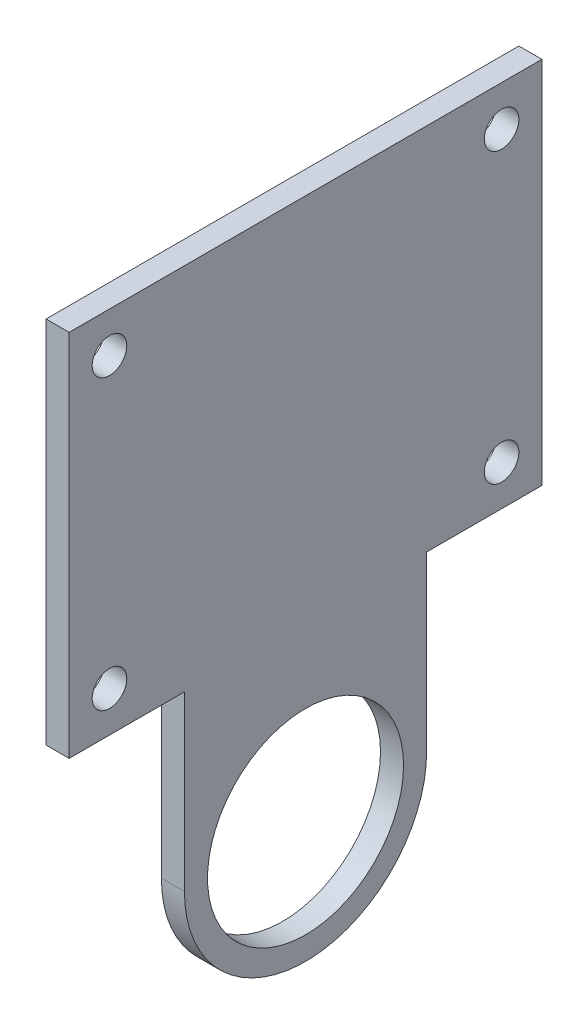
ISO-10303-21;
HEADER;
FILE_DESCRIPTION(('STEP AP214'),'2;1');
FILE_NAME('part.step','',(''),(''),'','','');
FILE_SCHEMA(('AUTOMOTIVE_DESIGN { 1 0 10303 214 1 1 1 1 }'));
ENDSEC;
DATA;
#1=APPLICATION_CONTEXT('core data for automotive mechanical design processes');
#2=APPLICATION_PROTOCOL_DEFINITION('international standard','automotive_design',2000,#1);
#3=PRODUCT_CONTEXT('',#1,'mechanical');
#4=PRODUCT('Part','Part','',(#3));
#5=PRODUCT_RELATED_PRODUCT_CATEGORY('part','',(#4));
#6=PRODUCT_DEFINITION_FORMATION('','',#4);
#7=PRODUCT_DEFINITION_CONTEXT('part definition',#1,'design');
#8=PRODUCT_DEFINITION('design','',#6,#7);
#9=PRODUCT_DEFINITION_SHAPE('','',#8);
#10=(LENGTH_UNIT() NAMED_UNIT(*) SI_UNIT(.MILLI.,.METRE.));
#11=(NAMED_UNIT(*) PLANE_ANGLE_UNIT() SI_UNIT($,.RADIAN.));
#12=(NAMED_UNIT(*) SI_UNIT($,.STERADIAN.) SOLID_ANGLE_UNIT());
#13=UNCERTAINTY_MEASURE_WITH_UNIT(LENGTH_MEASURE(1.E-05),#10,'distance_accuracy_value','');
#14=(GEOMETRIC_REPRESENTATION_CONTEXT(3) GLOBAL_UNCERTAINTY_ASSIGNED_CONTEXT((#13)) GLOBAL_UNIT_ASSIGNED_CONTEXT((#10,
#11,#12)) REPRESENTATION_CONTEXT('',''));
#15=CARTESIAN_POINT('',(0.,0.,0.));
#16=DIRECTION('',(0.,0.,1.));
#17=DIRECTION('',(1.,0.,0.));
#18=AXIS2_PLACEMENT_3D('',#15,#16,#17);
#19=CARTESIAN_POINT('',(2.,0.,0.));
#20=DIRECTION('',(-1.,0.,0.));
#21=DIRECTION('',(0.,0.,1.));
#22=AXIS2_PLACEMENT_3D('',#19,#20,#21);
#23=PLANE('',#22);
#24=CARTESIAN_POINT('',(2.,0.,0.));
#25=DIRECTION('',(1.,0.,0.));
#26=DIRECTION('',(0.,0.,1.));
#27=AXIS2_PLACEMENT_3D('',#24,#25,#26);
#28=CIRCLE('',#27,10.5);
#29=CARTESIAN_POINT('',(2.,0.,10.5));
#30=VERTEX_POINT('',#29);
#31=CARTESIAN_POINT('',(2.,0.,-10.5));
#32=VERTEX_POINT('',#31);
#33=EDGE_CURVE('E147',#30,#32,#28,.T.);
#34=ORIENTED_EDGE('',*,*,#33,.T.);
#35=DIRECTION('',(0.,1.,0.));
#36=VECTOR('',#35,1.);
#37=CARTESIAN_POINT('',(2.,15.,-10.5));
#38=LINE('',#37,#36);
#39=CARTESIAN_POINT('',(2.,15.,-10.5));
#40=VERTEX_POINT('',#39);
#41=EDGE_CURVE('E95',#32,#40,#38,.T.);
#42=ORIENTED_EDGE('',*,*,#41,.T.);
#43=DIRECTION('',(0.,0.,-1.));
#44=VECTOR('',#43,1.);
#45=CARTESIAN_POINT('',(2.,15.,-20.5));
#46=LINE('',#45,#44);
#47=CARTESIAN_POINT('',(2.,15.,-20.5));
#48=VERTEX_POINT('',#47);
#49=EDGE_CURVE('E162',#40,#48,#46,.T.);
#50=ORIENTED_EDGE('',*,*,#49,.T.);
#51=DIRECTION('',(0.,1.,0.));
#52=VECTOR('',#51,1.);
#53=CARTESIAN_POINT('',(2.,47.,-20.5));
#54=LINE('',#53,#52);
#55=CARTESIAN_POINT('',(2.,47.,-20.5));
#56=VERTEX_POINT('',#55);
#57=EDGE_CURVE('E175',#48,#56,#54,.T.);
#58=ORIENTED_EDGE('',*,*,#57,.T.);
#59=DIRECTION('',(0.,0.,1.));
#60=VECTOR('',#59,1.);
#61=CARTESIAN_POINT('',(2.,47.,20.5));
#62=LINE('',#61,#60);
#63=CARTESIAN_POINT('',(2.,47.,20.5));
#64=VERTEX_POINT('',#63);
#65=EDGE_CURVE('E114',#56,#64,#62,.T.);
#66=ORIENTED_EDGE('',*,*,#65,.T.);
#67=DIRECTION('',(0.,-1.,0.));
#68=VECTOR('',#67,1.);
#69=CARTESIAN_POINT('',(2.,47.,20.5));
#70=LINE('',#69,#68);
#71=CARTESIAN_POINT('',(2.,15.,20.5));
#72=VERTEX_POINT('',#71);
#73=EDGE_CURVE('E108',#64,#72,#70,.T.);
#74=ORIENTED_EDGE('',*,*,#73,.T.);
#75=DIRECTION('',(0.,0.,-1.));
#76=VECTOR('',#75,1.);
#77=CARTESIAN_POINT('',(2.,15.,10.5));
#78=LINE('',#77,#76);
#79=CARTESIAN_POINT('',(2.,15.,10.5));
#80=VERTEX_POINT('',#79);
#81=EDGE_CURVE('E112',#72,#80,#78,.T.);
#82=ORIENTED_EDGE('',*,*,#81,.T.);
#83=DIRECTION('',(0.,-1.,0.));
#84=VECTOR('',#83,1.);
#85=CARTESIAN_POINT('',(2.,0.,10.5));
#86=LINE('',#85,#84);
#87=EDGE_CURVE('E52',#80,#30,#86,.T.);
#88=ORIENTED_EDGE('',*,*,#87,.T.);
#89=EDGE_LOOP('',(#34,#42,#50,#58,#66,#74,#82,#88));
#90=FACE_BOUND('',#89,.T.);
#91=CARTESIAN_POINT('',(2.,0.,0.));
#92=DIRECTION('',(1.,0.,0.));
#93=DIRECTION('',(0.,0.,-1.));
#94=AXIS2_PLACEMENT_3D('',#91,#92,#93);
#95=CIRCLE('',#94,8.5);
#96=CARTESIAN_POINT('',(2.,0.,-8.5));
#97=VERTEX_POINT('',#96);
#98=EDGE_CURVE('E136',#97,#97,#95,.T.);
#99=ORIENTED_EDGE('',*,*,#98,.F.);
#100=EDGE_LOOP('',(#99));
#101=FACE_BOUND('',#100,.T.);
#102=CARTESIAN_POINT('',(2.,43.5,17.));
#103=DIRECTION('',(1.,0.,0.));
#104=DIRECTION('',(0.,0.,-1.));
#105=AXIS2_PLACEMENT_3D('',#102,#103,#104);
#106=CIRCLE('',#105,1.5);
#107=CARTESIAN_POINT('',(2.,43.5,15.5));
#108=VERTEX_POINT('',#107);
#109=EDGE_CURVE('E184',#108,#108,#106,.T.);
#110=ORIENTED_EDGE('',*,*,#109,.F.);
#111=EDGE_LOOP('',(#110));
#112=FACE_BOUND('',#111,.T.);
#113=CARTESIAN_POINT('',(2.,43.5,-17.));
#114=DIRECTION('',(1.,0.,0.));
#115=DIRECTION('',(0.,0.,-1.));
#116=AXIS2_PLACEMENT_3D('',#113,#114,#115);
#117=CIRCLE('',#116,1.5);
#118=CARTESIAN_POINT('',(2.,43.5,-18.5));
#119=VERTEX_POINT('',#118);
#120=EDGE_CURVE('E190',#119,#119,#117,.T.);
#121=ORIENTED_EDGE('',*,*,#120,.F.);
#122=EDGE_LOOP('',(#121));
#123=FACE_BOUND('',#122,.T.);
#124=CARTESIAN_POINT('',(2.,18.5,16.9999999999997));
#125=DIRECTION('',(1.,0.,0.));
#126=DIRECTION('',(0.,0.,-1.));
#127=AXIS2_PLACEMENT_3D('',#124,#125,#126);
#128=CIRCLE('',#127,1.5);
#129=CARTESIAN_POINT('',(2.,18.5,15.4999999999997));
#130=VERTEX_POINT('',#129);
#131=EDGE_CURVE('E196',#130,#130,#128,.T.);
#132=ORIENTED_EDGE('',*,*,#131,.F.);
#133=EDGE_LOOP('',(#132));
#134=FACE_BOUND('',#133,.T.);
#135=CARTESIAN_POINT('',(2.,18.5,-17.0000000000003));
#136=DIRECTION('',(1.,0.,0.));
#137=DIRECTION('',(0.,0.,-1.));
#138=AXIS2_PLACEMENT_3D('',#135,#136,#137);
#139=CIRCLE('',#138,1.5);
#140=CARTESIAN_POINT('',(2.,18.5,-18.5000000000003));
#141=VERTEX_POINT('',#140);
#142=EDGE_CURVE('E202',#141,#141,#139,.T.);
#143=ORIENTED_EDGE('',*,*,#142,.F.);
#144=EDGE_LOOP('',(#143));
#145=FACE_BOUND('',#144,.T.);
#146=ADVANCED_FACE('F35',(#90,#101,#112,#123,#134,#145),#23,.F.);
#147=CARTESIAN_POINT('',(0.,0.,0.));
#148=DIRECTION('',(-1.,0.,0.));
#149=DIRECTION('',(0.,0.,1.));
#150=AXIS2_PLACEMENT_3D('',#147,#148,#149);
#151=PLANE('',#150);
#152=CARTESIAN_POINT('',(0.,18.5,16.9999999999997));
#153=DIRECTION('',(1.,0.,0.));
#154=DIRECTION('',(0.,0.,-1.));
#155=AXIS2_PLACEMENT_3D('',#152,#153,#154);
#156=CIRCLE('',#155,1.5);
#157=CARTESIAN_POINT('',(0.,18.5,15.4999999999997));
#158=VERTEX_POINT('',#157);
#159=EDGE_CURVE('E199',#158,#158,#156,.T.);
#160=ORIENTED_EDGE('',*,*,#159,.T.);
#161=EDGE_LOOP('',(#160));
#162=FACE_BOUND('',#161,.T.);
#163=CARTESIAN_POINT('',(0.,43.5,17.));
#164=DIRECTION('',(1.,0.,0.));
#165=DIRECTION('',(0.,0.,-1.));
#166=AXIS2_PLACEMENT_3D('',#163,#164,#165);
#167=CIRCLE('',#166,1.5);
#168=CARTESIAN_POINT('',(0.,43.5,15.5));
#169=VERTEX_POINT('',#168);
#170=EDGE_CURVE('E187',#169,#169,#167,.T.);
#171=ORIENTED_EDGE('',*,*,#170,.T.);
#172=EDGE_LOOP('',(#171));
#173=FACE_BOUND('',#172,.T.);
#174=CARTESIAN_POINT('',(0.,0.,0.));
#175=DIRECTION('',(1.,0.,0.));
#176=DIRECTION('',(0.,0.,1.));
#177=AXIS2_PLACEMENT_3D('',#174,#175,#176);
#178=CIRCLE('',#177,10.5);
#179=CARTESIAN_POINT('',(0.,0.,10.5));
#180=VERTEX_POINT('',#179);
#181=CARTESIAN_POINT('',(0.,0.,-10.5));
#182=VERTEX_POINT('',#181);
#183=EDGE_CURVE('E132',#180,#182,#178,.T.);
#184=ORIENTED_EDGE('',*,*,#183,.F.);
#185=DIRECTION('',(0.,-1.,0.));
#186=VECTOR('',#185,1.);
#187=CARTESIAN_POINT('',(0.,0.,10.5));
#188=LINE('',#187,#186);
#189=CARTESIAN_POINT('',(0.,15.,10.5));
#190=VERTEX_POINT('',#189);
#191=EDGE_CURVE('E87',#190,#180,#188,.T.);
#192=ORIENTED_EDGE('',*,*,#191,.F.);
#193=DIRECTION('',(0.,0.,-1.));
#194=VECTOR('',#193,1.);
#195=CARTESIAN_POINT('',(0.,15.,10.5));
#196=LINE('',#195,#194);
#197=CARTESIAN_POINT('',(0.,15.,20.5));
#198=VERTEX_POINT('',#197);
#199=EDGE_CURVE('E81',#198,#190,#196,.T.);
#200=ORIENTED_EDGE('',*,*,#199,.F.);
#201=DIRECTION('',(0.,-1.,0.));
#202=VECTOR('',#201,1.);
#203=CARTESIAN_POINT('',(0.,47.,20.5));
#204=LINE('',#203,#202);
#205=CARTESIAN_POINT('',(0.,47.,20.5));
#206=VERTEX_POINT('',#205);
#207=EDGE_CURVE('E122',#206,#198,#204,.T.);
#208=ORIENTED_EDGE('',*,*,#207,.F.);
#209=DIRECTION('',(0.,0.,1.));
#210=VECTOR('',#209,1.);
#211=CARTESIAN_POINT('',(0.,47.,20.5));
#212=LINE('',#211,#210);
#213=CARTESIAN_POINT('',(0.,47.,-20.5));
#214=VERTEX_POINT('',#213);
#215=EDGE_CURVE('E142',#214,#206,#212,.T.);
#216=ORIENTED_EDGE('',*,*,#215,.F.);
#217=DIRECTION('',(0.,1.,0.));
#218=VECTOR('',#217,1.);
#219=CARTESIAN_POINT('',(0.,47.,-20.5));
#220=LINE('',#219,#218);
#221=CARTESIAN_POINT('',(0.,15.,-20.5));
#222=VERTEX_POINT('',#221);
#223=EDGE_CURVE('E140',#222,#214,#220,.T.);
#224=ORIENTED_EDGE('',*,*,#223,.F.);
#225=DIRECTION('',(0.,0.,-1.));
#226=VECTOR('',#225,1.);
#227=CARTESIAN_POINT('',(0.,15.,-20.5));
#228=LINE('',#227,#226);
#229=CARTESIAN_POINT('',(0.,15.,-10.5));
#230=VERTEX_POINT('',#229);
#231=EDGE_CURVE('E138',#230,#222,#228,.T.);
#232=ORIENTED_EDGE('',*,*,#231,.F.);
#233=DIRECTION('',(0.,1.,0.));
#234=VECTOR('',#233,1.);
#235=CARTESIAN_POINT('',(0.,15.,-10.5));
#236=LINE('',#235,#234);
#237=EDGE_CURVE('E135',#182,#230,#236,.T.);
#238=ORIENTED_EDGE('',*,*,#237,.F.);
#239=EDGE_LOOP('',(#184,#192,#200,#208,#216,#224,#232,#238));
#240=FACE_BOUND('',#239,.T.);
#241=CARTESIAN_POINT('',(0.,0.,0.));
#242=DIRECTION('',(1.,0.,0.));
#243=DIRECTION('',(0.,0.,-1.));
#244=AXIS2_PLACEMENT_3D('',#241,#242,#243);
#245=CIRCLE('',#244,8.5);
#246=CARTESIAN_POINT('',(0.,0.,-8.5));
#247=VERTEX_POINT('',#246);
#248=EDGE_CURVE('E181',#247,#247,#245,.T.);
#249=ORIENTED_EDGE('',*,*,#248,.T.);
#250=EDGE_LOOP('',(#249));
#251=FACE_BOUND('',#250,.T.);
#252=CARTESIAN_POINT('',(0.,43.5,-17.));
#253=DIRECTION('',(1.,0.,0.));
#254=DIRECTION('',(0.,0.,-1.));
#255=AXIS2_PLACEMENT_3D('',#252,#253,#254);
#256=CIRCLE('',#255,1.5);
#257=CARTESIAN_POINT('',(0.,43.5,-18.5));
#258=VERTEX_POINT('',#257);
#259=EDGE_CURVE('E193',#258,#258,#256,.T.);
#260=ORIENTED_EDGE('',*,*,#259,.T.);
#261=EDGE_LOOP('',(#260));
#262=FACE_BOUND('',#261,.T.);
#263=CARTESIAN_POINT('',(0.,18.5,-17.0000000000003));
#264=DIRECTION('',(1.,0.,0.));
#265=DIRECTION('',(0.,0.,-1.));
#266=AXIS2_PLACEMENT_3D('',#263,#264,#265);
#267=CIRCLE('',#266,1.5);
#268=CARTESIAN_POINT('',(0.,18.5,-18.5000000000003));
#269=VERTEX_POINT('',#268);
#270=EDGE_CURVE('E205',#269,#269,#267,.T.);
#271=ORIENTED_EDGE('',*,*,#270,.T.);
#272=EDGE_LOOP('',(#271));
#273=FACE_BOUND('',#272,.T.);
#274=ADVANCED_FACE('F166',(#162,#173,#240,#251,#262,#273),#151,.T.);
#275=CARTESIAN_POINT('',(2.,0.,0.));
#276=DIRECTION('',(-1.,0.,0.));
#277=DIRECTION('',(0.,0.,1.));
#278=AXIS2_PLACEMENT_3D('',#275,#276,#277);
#279=CYLINDRICAL_SURFACE('',#278,10.5);
#280=ORIENTED_EDGE('',*,*,#183,.T.);
#281=DIRECTION('',(-1.,0.,0.));
#282=VECTOR('',#281,1.);
#283=CARTESIAN_POINT('',(2.,0.,-10.5));
#284=LINE('',#283,#282);
#285=EDGE_CURVE('E11',#32,#182,#284,.T.);
#286=ORIENTED_EDGE('',*,*,#285,.F.);
#287=ORIENTED_EDGE('',*,*,#33,.F.);
#288=DIRECTION('',(-1.,0.,0.));
#289=VECTOR('',#288,1.);
#290=CARTESIAN_POINT('',(2.,0.,10.5));
#291=LINE('',#290,#289);
#292=EDGE_CURVE('E128',#30,#180,#291,.T.);
#293=ORIENTED_EDGE('',*,*,#292,.T.);
#294=EDGE_LOOP('',(#280,#286,#287,#293));
#295=FACE_BOUND('',#294,.T.);
#296=ADVANCED_FACE('F37',(#295),#279,.T.);
#297=CARTESIAN_POINT('',(2.,15.,-10.5));
#298=DIRECTION('',(0.,0.,1.));
#299=DIRECTION('',(0.,-1.,0.));
#300=AXIS2_PLACEMENT_3D('',#297,#298,#299);
#301=PLANE('',#300);
#302=ORIENTED_EDGE('',*,*,#237,.T.);
#303=DIRECTION('',(-1.,0.,0.));
#304=VECTOR('',#303,1.);
#305=CARTESIAN_POINT('',(2.,15.,-10.5));
#306=LINE('',#305,#304);
#307=EDGE_CURVE('E44',#40,#230,#306,.T.);
#308=ORIENTED_EDGE('',*,*,#307,.F.);
#309=ORIENTED_EDGE('',*,*,#41,.F.);
#310=ORIENTED_EDGE('',*,*,#285,.T.);
#311=EDGE_LOOP('',(#302,#308,#309,#310));
#312=FACE_BOUND('',#311,.T.);
#313=ADVANCED_FACE('F237',(#312),#301,.F.);
#314=CARTESIAN_POINT('',(2.,15.,-20.5));
#315=DIRECTION('',(0.,1.,0.));
#316=DIRECTION('',(0.,0.,1.));
#317=AXIS2_PLACEMENT_3D('',#314,#315,#316);
#318=PLANE('',#317);
#319=ORIENTED_EDGE('',*,*,#231,.T.);
#320=DIRECTION('',(-1.,0.,0.));
#321=VECTOR('',#320,1.);
#322=CARTESIAN_POINT('',(2.,15.,-20.5));
#323=LINE('',#322,#321);
#324=EDGE_CURVE('E154',#48,#222,#323,.T.);
#325=ORIENTED_EDGE('',*,*,#324,.F.);
#326=ORIENTED_EDGE('',*,*,#49,.F.);
#327=ORIENTED_EDGE('',*,*,#307,.T.);
#328=EDGE_LOOP('',(#319,#325,#326,#327));
#329=FACE_BOUND('',#328,.T.);
#330=ADVANCED_FACE('F160',(#329),#318,.F.);
#331=CARTESIAN_POINT('',(2.,47.,-20.5));
#332=DIRECTION('',(0.,0.,1.));
#333=DIRECTION('',(0.,-1.,0.));
#334=AXIS2_PLACEMENT_3D('',#331,#332,#333);
#335=PLANE('',#334);
#336=ORIENTED_EDGE('',*,*,#223,.T.);
#337=DIRECTION('',(-1.,0.,0.));
#338=VECTOR('',#337,1.);
#339=CARTESIAN_POINT('',(2.,47.,-20.5));
#340=LINE('',#339,#338);
#341=EDGE_CURVE('E151',#56,#214,#340,.T.);
#342=ORIENTED_EDGE('',*,*,#341,.F.);
#343=ORIENTED_EDGE('',*,*,#57,.F.);
#344=ORIENTED_EDGE('',*,*,#324,.T.);
#345=EDGE_LOOP('',(#336,#342,#343,#344));
#346=FACE_BOUND('',#345,.T.);
#347=ADVANCED_FACE('F171',(#346),#335,.F.);
#348=CARTESIAN_POINT('',(2.,47.,20.5));
#349=DIRECTION('',(0.,-1.,0.));
#350=DIRECTION('',(0.,0.,-1.));
#351=AXIS2_PLACEMENT_3D('',#348,#349,#350);
#352=PLANE('',#351);
#353=ORIENTED_EDGE('',*,*,#215,.T.);
#354=DIRECTION('',(-1.,0.,0.));
#355=VECTOR('',#354,1.);
#356=CARTESIAN_POINT('',(2.,47.,20.5));
#357=LINE('',#356,#355);
#358=EDGE_CURVE('E123',#64,#206,#357,.T.);
#359=ORIENTED_EDGE('',*,*,#358,.F.);
#360=ORIENTED_EDGE('',*,*,#65,.F.);
#361=ORIENTED_EDGE('',*,*,#341,.T.);
#362=EDGE_LOOP('',(#353,#359,#360,#361));
#363=FACE_BOUND('',#362,.T.);
#364=ADVANCED_FACE('F174',(#363),#352,.F.);
#365=CARTESIAN_POINT('',(2.,47.,20.5));
#366=DIRECTION('',(0.,0.,-1.));
#367=DIRECTION('',(-1.,0.,0.));
#368=AXIS2_PLACEMENT_3D('',#365,#366,#367);
#369=PLANE('',#368);
#370=ORIENTED_EDGE('',*,*,#207,.T.);
#371=DIRECTION('',(-1.,0.,0.));
#372=VECTOR('',#371,1.);
#373=CARTESIAN_POINT('',(2.,15.,20.5));
#374=LINE('',#373,#372);
#375=EDGE_CURVE('E119',#72,#198,#374,.T.);
#376=ORIENTED_EDGE('',*,*,#375,.F.);
#377=ORIENTED_EDGE('',*,*,#73,.F.);
#378=ORIENTED_EDGE('',*,*,#358,.T.);
#379=EDGE_LOOP('',(#370,#376,#377,#378));
#380=FACE_BOUND('',#379,.T.);
#381=ADVANCED_FACE('F120',(#380),#369,.F.);
#382=CARTESIAN_POINT('',(2.,15.,10.5));
#383=DIRECTION('',(0.,1.,0.));
#384=DIRECTION('',(0.,0.,1.));
#385=AXIS2_PLACEMENT_3D('',#382,#383,#384);
#386=PLANE('',#385);
#387=ORIENTED_EDGE('',*,*,#199,.T.);
#388=DIRECTION('',(-1.,0.,0.));
#389=VECTOR('',#388,1.);
#390=CARTESIAN_POINT('',(2.,15.,10.5));
#391=LINE('',#390,#389);
#392=EDGE_CURVE('E124',#80,#190,#391,.T.);
#393=ORIENTED_EDGE('',*,*,#392,.F.);
#394=ORIENTED_EDGE('',*,*,#81,.F.);
#395=ORIENTED_EDGE('',*,*,#375,.T.);
#396=EDGE_LOOP('',(#387,#393,#394,#395));
#397=FACE_BOUND('',#396,.T.);
#398=ADVANCED_FACE('F126',(#397),#386,.F.);
#399=CARTESIAN_POINT('',(2.,0.,10.5));
#400=DIRECTION('',(0.,0.,-1.));
#401=DIRECTION('',(-1.,0.,0.));
#402=AXIS2_PLACEMENT_3D('',#399,#400,#401);
#403=PLANE('',#402);
#404=ORIENTED_EDGE('',*,*,#191,.T.);
#405=ORIENTED_EDGE('',*,*,#292,.F.);
#406=ORIENTED_EDGE('',*,*,#87,.F.);
#407=ORIENTED_EDGE('',*,*,#392,.T.);
#408=EDGE_LOOP('',(#404,#405,#406,#407));
#409=FACE_BOUND('',#408,.T.);
#410=ADVANCED_FACE('F225',(#409),#403,.F.);
#411=CARTESIAN_POINT('',(2.,0.,0.));
#412=DIRECTION('',(-1.,0.,0.));
#413=DIRECTION('',(0.,0.,1.));
#414=AXIS2_PLACEMENT_3D('',#411,#412,#413);
#415=CYLINDRICAL_SURFACE('',#414,8.5);
#416=ORIENTED_EDGE('',*,*,#98,.T.);
#417=EDGE_LOOP('',(#416));
#418=FACE_BOUND('',#417,.T.);
#419=ORIENTED_EDGE('',*,*,#248,.F.);
#420=EDGE_LOOP('',(#419));
#421=FACE_BOUND('',#420,.T.);
#422=ADVANCED_FACE('F222',(#418,#421),#415,.F.);
#423=CARTESIAN_POINT('',(2.,43.5,17.));
#424=DIRECTION('',(-1.,0.,0.));
#425=DIRECTION('',(0.,0.,1.));
#426=AXIS2_PLACEMENT_3D('',#423,#424,#425);
#427=CYLINDRICAL_SURFACE('',#426,1.5);
#428=ORIENTED_EDGE('',*,*,#109,.T.);
#429=EDGE_LOOP('',(#428));
#430=FACE_BOUND('',#429,.T.);
#431=ORIENTED_EDGE('',*,*,#170,.F.);
#432=EDGE_LOOP('',(#431));
#433=FACE_BOUND('',#432,.T.);
#434=ADVANCED_FACE('F301',(#430,#433),#427,.F.);
#435=CARTESIAN_POINT('',(2.,43.5,-17.));
#436=DIRECTION('',(-1.,0.,0.));
#437=DIRECTION('',(0.,0.,1.));
#438=AXIS2_PLACEMENT_3D('',#435,#436,#437);
#439=CYLINDRICAL_SURFACE('',#438,1.5);
#440=ORIENTED_EDGE('',*,*,#120,.T.);
#441=EDGE_LOOP('',(#440));
#442=FACE_BOUND('',#441,.T.);
#443=ORIENTED_EDGE('',*,*,#259,.F.);
#444=EDGE_LOOP('',(#443));
#445=FACE_BOUND('',#444,.T.);
#446=ADVANCED_FACE('F309',(#442,#445),#439,.F.);
#447=CARTESIAN_POINT('',(2.,18.5,16.9999999999997));
#448=DIRECTION('',(-1.,0.,0.));
#449=DIRECTION('',(0.,0.,1.));
#450=AXIS2_PLACEMENT_3D('',#447,#448,#449);
#451=CYLINDRICAL_SURFACE('',#450,1.5);
#452=ORIENTED_EDGE('',*,*,#131,.T.);
#453=EDGE_LOOP('',(#452));
#454=FACE_BOUND('',#453,.T.);
#455=ORIENTED_EDGE('',*,*,#159,.F.);
#456=EDGE_LOOP('',(#455));
#457=FACE_BOUND('',#456,.T.);
#458=ADVANCED_FACE('F317',(#454,#457),#451,.F.);
#459=CARTESIAN_POINT('',(2.,18.5,-17.0000000000003));
#460=DIRECTION('',(-1.,0.,0.));
#461=DIRECTION('',(0.,0.,1.));
#462=AXIS2_PLACEMENT_3D('',#459,#460,#461);
#463=CYLINDRICAL_SURFACE('',#462,1.5);
#464=ORIENTED_EDGE('',*,*,#142,.T.);
#465=EDGE_LOOP('',(#464));
#466=FACE_BOUND('',#465,.T.);
#467=ORIENTED_EDGE('',*,*,#270,.F.);
#468=EDGE_LOOP('',(#467));
#469=FACE_BOUND('',#468,.T.);
#470=ADVANCED_FACE('F211',(#466,#469),#463,.F.);
#471=CLOSED_SHELL('',(#146,#274,#296,#313,#330,#347,#364,#381,#398,#410,#422,#434,#446,#458,#470));
#472=MANIFOLD_SOLID_BREP('B2',#471);
#473=ADVANCED_BREP_SHAPE_REPRESENTATION('',(#18,#472),#14);
#474=SHAPE_DEFINITION_REPRESENTATION(#9,#473);
ENDSEC;
END-ISO-10303-21;
